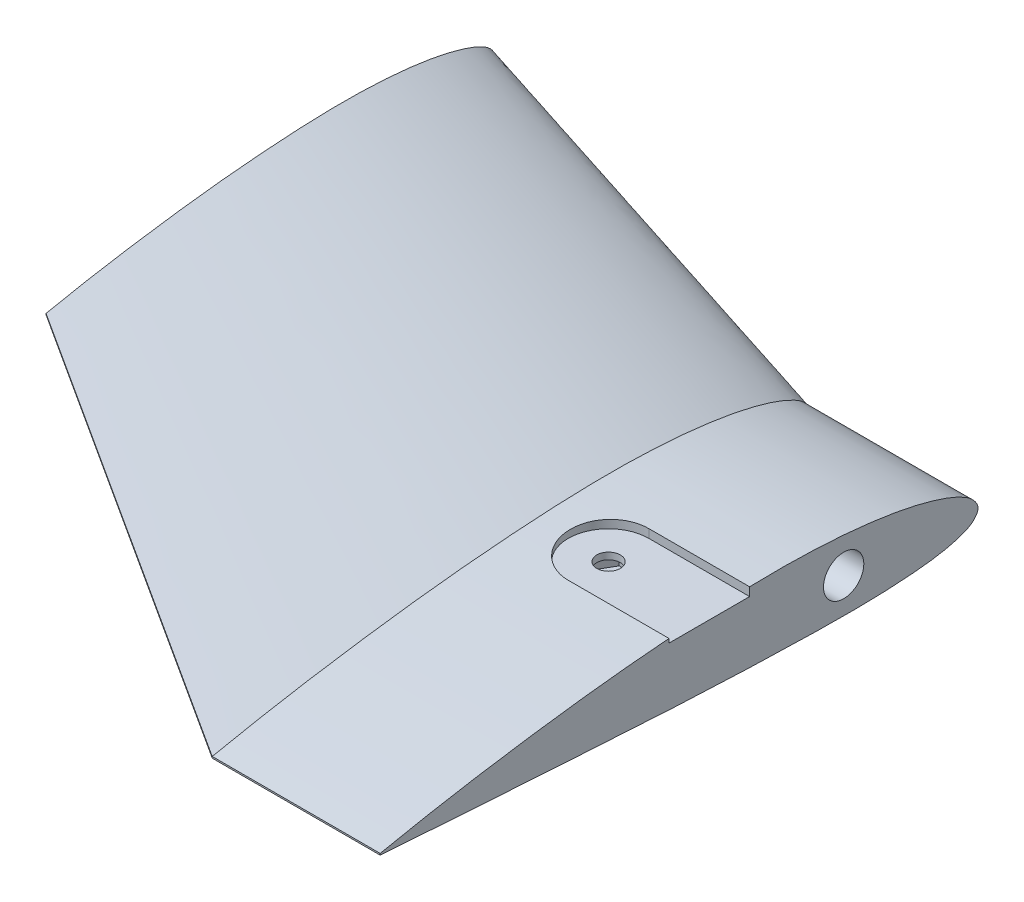
ISO-10303-21;
HEADER;
FILE_DESCRIPTION(('STEP AP214'),'2;1');
FILE_NAME('part.step','',(''),(''),'','','');
FILE_SCHEMA(('AUTOMOTIVE_DESIGN { 1 0 10303 214 1 1 1 1 }'));
ENDSEC;
DATA;
#1=APPLICATION_CONTEXT('core data for automotive mechanical design processes');
#2=APPLICATION_PROTOCOL_DEFINITION('international standard','automotive_design',2000,#1);
#3=PRODUCT_CONTEXT('',#1,'mechanical');
#4=PRODUCT('Part','Part','',(#3));
#5=PRODUCT_RELATED_PRODUCT_CATEGORY('part','',(#4));
#6=PRODUCT_DEFINITION_FORMATION('','',#4);
#7=PRODUCT_DEFINITION_CONTEXT('part definition',#1,'design');
#8=PRODUCT_DEFINITION('design','',#6,#7);
#9=PRODUCT_DEFINITION_SHAPE('','',#8);
#10=(LENGTH_UNIT() NAMED_UNIT(*) SI_UNIT(.MILLI.,.METRE.));
#11=(NAMED_UNIT(*) PLANE_ANGLE_UNIT() SI_UNIT($,.RADIAN.));
#12=(NAMED_UNIT(*) SI_UNIT($,.STERADIAN.) SOLID_ANGLE_UNIT());
#13=UNCERTAINTY_MEASURE_WITH_UNIT(LENGTH_MEASURE(1.E-05),#10,'distance_accuracy_value','');
#14=(GEOMETRIC_REPRESENTATION_CONTEXT(3) GLOBAL_UNCERTAINTY_ASSIGNED_CONTEXT((#13)) GLOBAL_UNIT_ASSIGNED_CONTEXT((#10,
#11,#12)) REPRESENTATION_CONTEXT('',''));
#15=CARTESIAN_POINT('',(0.,0.,0.));
#16=DIRECTION('',(0.,0.,1.));
#17=DIRECTION('',(1.,0.,0.));
#18=AXIS2_PLACEMENT_3D('',#15,#16,#17);
#19=CARTESIAN_POINT('',(-270.,22.7191945863651,20.));
#20=DIRECTION('',(1.,0.,0.));
#21=DIRECTION('',(0.,0.,-1.));
#22=AXIS2_PLACEMENT_3D('',#19,#20,#21);
#23=CYLINDRICAL_SURFACE('',#22,2.99999999999999);
#24=CARTESIAN_POINT('',(-270.,22.7191945863651,20.));
#25=DIRECTION('',(1.,0.,0.));
#26=DIRECTION('',(0.,0.,-1.));
#27=AXIS2_PLACEMENT_3D('',#24,#25,#26);
#28=CIRCLE('',#27,2.99999999999999);
#29=CARTESIAN_POINT('',(-270.,22.7191945863651,17.));
#30=VERTEX_POINT('',#29);
#31=EDGE_CURVE('E188',#30,#30,#28,.T.);
#32=ORIENTED_EDGE('',*,*,#31,.F.);
#33=EDGE_LOOP('',(#32));
#34=FACE_BOUND('',#33,.T.);
#35=CARTESIAN_POINT('',(-250.,22.7191945863651,20.));
#36=DIRECTION('',(1.,0.,0.));
#37=DIRECTION('',(0.,0.,-1.));
#38=AXIS2_PLACEMENT_3D('',#35,#36,#37);
#39=CIRCLE('',#38,2.99999999999999);
#40=CARTESIAN_POINT('',(-250.,22.7191945863651,17.));
#41=VERTEX_POINT('',#40);
#42=EDGE_CURVE('E197',#41,#41,#39,.T.);
#43=ORIENTED_EDGE('',*,*,#42,.T.);
#44=EDGE_LOOP('',(#43));
#45=FACE_BOUND('',#44,.T.);
#46=ADVANCED_FACE('F68',(#34,#45),#23,.F.);
#47=CARTESIAN_POINT('',(-270.,22.7191945863651,20.));
#48=DIRECTION('',(1.,0.,0.));
#49=DIRECTION('',(0.,0.,-1.));
#50=AXIS2_PLACEMENT_3D('',#47,#48,#49);
#51=PLANE('',#50);
#52=ORIENTED_EDGE('',*,*,#31,.T.);
#53=EDGE_LOOP('',(#52));
#54=FACE_BOUND('',#53,.T.);
#55=ADVANCED_FACE('F240',(#54),#51,.T.);
#56=CARTESIAN_POINT('',(-250.,0.,0.));
#57=DIRECTION('',(1.,0.,0.));
#58=DIRECTION('',(0.,0.,-1.));
#59=AXIS2_PLACEMENT_3D('',#56,#57,#58);
#60=PLANE('',#59);
#61=ORIENTED_EDGE('',*,*,#42,.F.);
#62=EDGE_LOOP('',(#61));
#63=FACE_BOUND('',#62,.T.);
#64=CARTESIAN_POINT('',(-250.,21.3886732850242,89.));
#65=CARTESIAN_POINT('',(-250.,21.6924393138106,87.5175902156763));
#66=CARTESIAN_POINT('',(-250.,22.2991735538198,84.5566640796384));
#67=CARTESIAN_POINT('',(-250.,23.4104909631112,78.6297269469736));
#68=CARTESIAN_POINT('',(-250.,24.641831569462,71.2170631809324));
#69=CARTESIAN_POINT('',(-250.,25.9162390672229,62.3159799477099));
#70=CARTESIAN_POINT('',(-250.,26.9790478293723,53.4163650243348));
#71=CARTESIAN_POINT('',(-250.,27.757252312656,44.5128917718668));
#72=CARTESIAN_POINT('',(-250.,28.2842497525229,35.6114461447732));
#73=CARTESIAN_POINT('',(-250.,28.3734546736372,28.1847004811248));
#74=CARTESIAN_POINT('',(-250.,28.1277297242642,22.2491575224991));
#75=CARTESIAN_POINT('',(-250.,27.7676716658709,17.7938603249267));
#76=CARTESIAN_POINT('',(-250.,27.1974963055456,13.3329383648118));
#77=CARTESIAN_POINT('',(-250.,26.4953694537602,9.62034210956704));
#78=CARTESIAN_POINT('',(-250.,25.701015566182,6.66058751576171));
#79=CARTESIAN_POINT('',(-250.,24.9788303768218,4.4166755350325));
#80=CARTESIAN_POINT('',(-250.,24.1373761617376,2.51552543990555));
#81=CARTESIAN_POINT('',(-250.,23.1172060054036,0.875610555548998));
#82=CARTESIAN_POINT('',(-250.,21.3529663487488,-0.554450875401541));
#83=CARTESIAN_POINT('',(-250.,19.8022315361252,0.931001928104729));
#84=CARTESIAN_POINT('',(-250.,19.0949550918379,2.54024256096899));
#85=CARTESIAN_POINT('',(-250.,18.5577036137218,4.43302859202716));
#86=CARTESIAN_POINT('',(-250.,18.1724928525861,6.66955299200507));
#87=CARTESIAN_POINT('',(-250.,17.8437583770492,9.64115310370391));
#88=CARTESIAN_POINT('',(-250.,17.590735707999,13.3504314681179));
#89=CARTESIAN_POINT('',(-250.,17.4892914666729,17.8043187113869));
#90=CARTESIAN_POINT('',(-250.,17.5034280625483,22.2550272141336));
#91=CARTESIAN_POINT('',(-250.,17.6344002740936,28.1885067397123));
#92=CARTESIAN_POINT('',(-250.,17.8700772068071,35.6060485187279));
#93=CARTESIAN_POINT('',(-250.,18.280226492312,44.5059981210921));
#94=CARTESIAN_POINT('',(-250.,18.8133186654621,53.4033670106579));
#95=CARTESIAN_POINT('',(-250.,19.3674253006102,62.3022449763705));
#96=CARTESIAN_POINT('',(-250.,19.9283008784247,71.2026444966919));
#97=CARTESIAN_POINT('',(-250.,20.4448648269986,78.6172037371231));
#98=CARTESIAN_POINT('',(-250.,20.8433000555565,84.5506800402072));
#99=CARTESIAN_POINT('',(-250.,21.052621242818,87.5168254487195));
#100=CARTESIAN_POINT('',(-250.,21.1572890238036,89.));
#101=B_SPLINE_CURVE_WITH_KNOTS('',3,(#64,#65,#66,#67,#68,#69,#70,#71,#72,#73,#74,#75,#76,#77,
#78,#79,#80,#81,#82,#83,#84,#85,#86,#87,#88,#89,#90,#91,#92,#93,#94,#95,#96,#97,#98,#99,#100),
.UNSPECIFIED.,.F.,.F.,(4,1,1,1,1,1,1,1,1,1,1,1,1,1,1,1,1,1,1,1,1,1,1,1,1,1,1,1,1,1,1,1,1,1,4),
(0.,0.0250124897498648,0.0499592861642578,0.0996729249269686,0.149206319909966,
0.198581096615965,0.247805170456833,0.296916574601493,0.345952721793533,0.370491625569911,
0.395091203654929,0.41981479582396,0.444798575016595,0.457489818915221,0.47040640543549,
0.483879408669829,0.491264120322896,0.503458853294665,0.513609129403887,0.520450990700287,
0.533235387615153,0.545691039147803,0.558031884237173,0.582609167247894,0.607134741746914,
0.631652079836766,0.656174271859652,0.705233949250519,0.754320378530032,0.803437363555032,
0.852566095729537,0.901700994033255,0.950848809337271,0.975422716989279,1.),.UNSPECIFIED.);
#102=CARTESIAN_POINT('',(-250.,21.1572890238036,89.));
#103=VERTEX_POINT('',#102);
#104=CARTESIAN_POINT('',(-250.,28.2645174071928,33.9999990139523));
#105=VERTEX_POINT('',#104);
#106=EDGE_CURVE('E262',#103,#105,#101,.F.);
#107=ORIENTED_EDGE('',*,*,#106,.T.);
#108=DIRECTION('',(0.,-1.,0.));
#109=VECTOR('',#108,1.);
#110=CARTESIAN_POINT('',(-250.,27.,33.9999990139523));
#111=LINE('',#110,#109);
#112=CARTESIAN_POINT('',(-250.,27.,33.9999990139523));
#113=VERTEX_POINT('',#112);
#114=EDGE_CURVE('E83',#105,#113,#111,.T.);
#115=ORIENTED_EDGE('',*,*,#114,.T.);
#116=DIRECTION('',(0.,0.,-1.));
#117=VECTOR('',#116,1.);
#118=CARTESIAN_POINT('',(-250.,27.,0.));
#119=LINE('',#118,#117);
#120=CARTESIAN_POINT('',(-250.,27.,45.9999990139523));
#121=VERTEX_POINT('',#120);
#122=EDGE_CURVE('E12',#121,#113,#119,.T.);
#123=ORIENTED_EDGE('',*,*,#122,.F.);
#124=DIRECTION('',(0.,-1.,0.));
#125=VECTOR('',#124,1.);
#126=CARTESIAN_POINT('',(-250.,27.,45.9999990139523));
#127=LINE('',#126,#125);
#128=CARTESIAN_POINT('',(-250.,27.6028781432274,45.9999990139523));
#129=VERTEX_POINT('',#128);
#130=EDGE_CURVE('E260',#129,#121,#127,.T.);
#131=ORIENTED_EDGE('',*,*,#130,.F.);
#132=CARTESIAN_POINT('',(-250.,21.3886732850242,89.));
#133=VERTEX_POINT('',#132);
#134=EDGE_CURVE('E169',#129,#133,#101,.F.);
#135=ORIENTED_EDGE('',*,*,#134,.T.);
#136=DIRECTION('',(0.,1.,0.));
#137=VECTOR('',#136,1.);
#138=CARTESIAN_POINT('',(-250.,0.,89.));
#139=LINE('',#138,#137);
#140=EDGE_CURVE('E112',#103,#133,#139,.T.);
#141=ORIENTED_EDGE('',*,*,#140,.F.);
#142=EDGE_LOOP('',(#107,#115,#123,#131,#135,#141));
#143=FACE_BOUND('',#142,.T.);
#144=ADVANCED_FACE('F218',(#63,#143),#60,.T.);
#145=CARTESIAN_POINT('',(-250.,21.3886732850242,89.));
#146=CARTESIAN_POINT('',(-250.,21.6924393138106,87.5175902156763));
#147=CARTESIAN_POINT('',(-250.,22.2991735538198,84.5566640796384));
#148=CARTESIAN_POINT('',(-250.,23.4104909631112,78.6297269469736));
#149=CARTESIAN_POINT('',(-250.,24.641831569462,71.2170631809324));
#150=CARTESIAN_POINT('',(-250.,25.9162390672229,62.3159799477099));
#151=CARTESIAN_POINT('',(-250.,26.9790478293723,53.4163650243348));
#152=CARTESIAN_POINT('',(-250.,27.757252312656,44.5128917718668));
#153=CARTESIAN_POINT('',(-250.,28.2842497525229,35.6114461447732));
#154=CARTESIAN_POINT('',(-250.,28.3734546736372,28.1847004811248));
#155=CARTESIAN_POINT('',(-250.,28.1277297242642,22.2491575224991));
#156=CARTESIAN_POINT('',(-250.,27.7676716658709,17.7938603249267));
#157=CARTESIAN_POINT('',(-250.,27.1974963055456,13.3329383648118));
#158=CARTESIAN_POINT('',(-250.,26.4953694537602,9.62034210956704));
#159=CARTESIAN_POINT('',(-250.,25.701015566182,6.66058751576171));
#160=CARTESIAN_POINT('',(-250.,24.9788303768218,4.4166755350325));
#161=CARTESIAN_POINT('',(-250.,24.1373761617376,2.51552543990555));
#162=CARTESIAN_POINT('',(-250.,23.1172060054036,0.875610555548998));
#163=CARTESIAN_POINT('',(-250.,21.3529663487488,-0.554450875401541));
#164=CARTESIAN_POINT('',(-250.,19.8022315361252,0.931001928104729));
#165=CARTESIAN_POINT('',(-250.,19.0949550918379,2.54024256096899));
#166=CARTESIAN_POINT('',(-250.,18.5577036137218,4.43302859202716));
#167=CARTESIAN_POINT('',(-250.,18.1724928525861,6.66955299200507));
#168=CARTESIAN_POINT('',(-250.,17.8437583770492,9.64115310370391));
#169=CARTESIAN_POINT('',(-250.,17.590735707999,13.3504314681179));
#170=CARTESIAN_POINT('',(-250.,17.4892914666729,17.8043187113869));
#171=CARTESIAN_POINT('',(-250.,17.5034280625483,22.2550272141336));
#172=CARTESIAN_POINT('',(-250.,17.6344002740936,28.1885067397123));
#173=CARTESIAN_POINT('',(-250.,17.8700772068071,35.6060485187279));
#174=CARTESIAN_POINT('',(-250.,18.280226492312,44.5059981210921));
#175=CARTESIAN_POINT('',(-250.,18.8133186654621,53.4033670106579));
#176=CARTESIAN_POINT('',(-250.,19.3674253006102,62.3022449763705));
#177=CARTESIAN_POINT('',(-250.,19.9283008784247,71.2026444966919));
#178=CARTESIAN_POINT('',(-250.,20.4448648269986,78.6172037371231));
#179=CARTESIAN_POINT('',(-250.,20.8433000555565,84.5506800402072));
#180=CARTESIAN_POINT('',(-250.,21.052621242818,87.5168254487195));
#181=CARTESIAN_POINT('',(-250.,21.1572890238036,89.));
#182=B_SPLINE_CURVE_WITH_KNOTS('',3,(#145,#146,#147,#148,#149,#150,#151,#152,#153,#154,#155,
#156,#157,#158,#159,#160,#161,#162,#163,#164,#165,#166,#167,#168,#169,#170,#171,#172,#173,#174,
#175,#176,#177,#178,#179,#180,#181),.UNSPECIFIED.,.F.,.F.,(4,1,1,1,1,1,1,1,1,1,1,1,1,1,1,1,1,1,
1,1,1,1,1,1,1,1,1,1,1,1,1,1,1,1,4),(0.,0.0250124897498648,0.0499592861642578,0.0996729249269686,
0.149206319909966,0.198581096615965,0.247805170456833,0.296916574601493,0.345952721793533,
0.370491625569911,0.395091203654929,0.41981479582396,0.444798575016595,0.457489818915221,
0.47040640543549,0.483879408669829,0.491264120322896,0.503458853294665,0.513609129403887,
0.520450990700287,0.533235387615153,0.545691039147803,0.558031884237173,0.582609167247894,
0.607134741746914,0.631652079836766,0.656174271859652,0.705233949250519,0.754320378530032,
0.803437363555032,0.852566095729537,0.901700994033255,0.950848809337271,0.975422716989279,1.),.UNSPECIFIED.);
#183=DIRECTION('',(1.,0.,0.));
#184=VECTOR('',#183,1.);
#185=SURFACE_OF_LINEAR_EXTRUSION('',#182,#184);
#186=ORIENTED_EDGE('',*,*,#106,.F.);
#187=DIRECTION('',(1.,0.,0.));
#188=VECTOR('',#187,1.);
#189=CARTESIAN_POINT('',(-250.,21.1572890238036,89.));
#190=LINE('',#189,#188);
#191=CARTESIAN_POINT('',(-275.,21.1572890238036,89.));
#192=VERTEX_POINT('',#191);
#193=EDGE_CURVE('E91',#192,#103,#190,.T.);
#194=ORIENTED_EDGE('',*,*,#193,.F.);
#195=CARTESIAN_POINT('',(-275.,21.3886732850242,89.));
#196=CARTESIAN_POINT('',(-275.,21.6924393138106,87.5175902156763));
#197=CARTESIAN_POINT('',(-275.,22.2991735538198,84.5566640796384));
#198=CARTESIAN_POINT('',(-275.,23.4104909631112,78.6297269469736));
#199=CARTESIAN_POINT('',(-275.,24.641831569462,71.2170631809324));
#200=CARTESIAN_POINT('',(-275.,25.9162390672229,62.3159799477099));
#201=CARTESIAN_POINT('',(-275.,26.9790478293723,53.4163650243348));
#202=CARTESIAN_POINT('',(-275.,27.757252312656,44.5128917718668));
#203=CARTESIAN_POINT('',(-275.,28.2842497525229,35.6114461447732));
#204=CARTESIAN_POINT('',(-275.,28.3734546736372,28.1847004811248));
#205=CARTESIAN_POINT('',(-275.,28.1277297242642,22.2491575224991));
#206=CARTESIAN_POINT('',(-275.,27.7676716658709,17.7938603249267));
#207=CARTESIAN_POINT('',(-275.,27.1974963055456,13.3329383648118));
#208=CARTESIAN_POINT('',(-275.,26.4953694537602,9.62034210956704));
#209=CARTESIAN_POINT('',(-275.,25.701015566182,6.66058751576171));
#210=CARTESIAN_POINT('',(-275.,24.9788303768218,4.4166755350325));
#211=CARTESIAN_POINT('',(-275.,24.1373761617376,2.51552543990555));
#212=CARTESIAN_POINT('',(-275.,23.1172060054036,0.875610555548998));
#213=CARTESIAN_POINT('',(-275.,21.3529663487488,-0.554450875401541));
#214=CARTESIAN_POINT('',(-275.,19.8022315361252,0.931001928104729));
#215=CARTESIAN_POINT('',(-275.,19.0949550918379,2.54024256096899));
#216=CARTESIAN_POINT('',(-275.,18.5577036137218,4.43302859202716));
#217=CARTESIAN_POINT('',(-275.,18.1724928525861,6.66955299200507));
#218=CARTESIAN_POINT('',(-275.,17.8437583770492,9.64115310370391));
#219=CARTESIAN_POINT('',(-275.,17.590735707999,13.3504314681179));
#220=CARTESIAN_POINT('',(-275.,17.4892914666729,17.8043187113869));
#221=CARTESIAN_POINT('',(-275.,17.5034280625483,22.2550272141336));
#222=CARTESIAN_POINT('',(-275.,17.6344002740936,28.1885067397123));
#223=CARTESIAN_POINT('',(-275.,17.8700772068071,35.6060485187279));
#224=CARTESIAN_POINT('',(-275.,18.280226492312,44.5059981210921));
#225=CARTESIAN_POINT('',(-275.,18.8133186654621,53.4033670106579));
#226=CARTESIAN_POINT('',(-275.,19.3674253006102,62.3022449763705));
#227=CARTESIAN_POINT('',(-275.,19.9283008784247,71.2026444966919));
#228=CARTESIAN_POINT('',(-275.,20.4448648269986,78.6172037371231));
#229=CARTESIAN_POINT('',(-275.,20.8433000555565,84.5506800402072));
#230=CARTESIAN_POINT('',(-275.,21.052621242818,87.5168254487195));
#231=CARTESIAN_POINT('',(-275.,21.1572890238036,89.));
#232=B_SPLINE_CURVE_WITH_KNOTS('',3,(#195,#196,#197,#198,#199,#200,#201,#202,#203,#204,#205,
#206,#207,#208,#209,#210,#211,#212,#213,#214,#215,#216,#217,#218,#219,#220,#221,#222,#223,#224,
#225,#226,#227,#228,#229,#230,#231),.UNSPECIFIED.,.F.,.F.,(4,1,1,1,1,1,1,1,1,1,1,1,1,1,1,1,1,1,
1,1,1,1,1,1,1,1,1,1,1,1,1,1,1,1,4),(0.,0.0250124897498648,0.0499592861642578,0.0996729249269686,
0.149206319909966,0.198581096615965,0.247805170456833,0.296916574601493,0.345952721793533,
0.370491625569911,0.395091203654929,0.41981479582396,0.444798575016595,0.457489818915221,
0.47040640543549,0.483879408669829,0.491264120322896,0.503458853294665,0.513609129403887,
0.520450990700287,0.533235387615153,0.545691039147803,0.558031884237173,0.582609167247894,
0.607134741746914,0.631652079836766,0.656174271859652,0.705233949250519,0.754320378530032,
0.803437363555032,0.852566095729537,0.901700994033255,0.950848809337271,0.975422716989279,1.),.UNSPECIFIED.);
#233=CARTESIAN_POINT('',(-275.,21.3886732850242,89.));
#234=VERTEX_POINT('',#233);
#235=EDGE_CURVE('E102',#234,#192,#232,.T.);
#236=ORIENTED_EDGE('',*,*,#235,.F.);
#237=DIRECTION('',(1.,0.,0.));
#238=VECTOR('',#237,1.);
#239=CARTESIAN_POINT('',(-250.,21.3886732850242,89.));
#240=LINE('',#239,#238);
#241=EDGE_CURVE('E206',#234,#133,#240,.T.);
#242=ORIENTED_EDGE('',*,*,#241,.T.);
#243=ORIENTED_EDGE('',*,*,#134,.F.);
#244=DIRECTION('',(1.,0.,0.));
#245=VECTOR('',#244,1.);
#246=CARTESIAN_POINT('',(-250.,27.6028781432274,45.9999990139523));
#247=LINE('',#246,#245);
#248=CARTESIAN_POINT('',(-265.,27.6028781432274,45.9999990139523));
#249=VERTEX_POINT('',#248);
#250=EDGE_CURVE('E164',#249,#129,#247,.T.);
#251=ORIENTED_EDGE('',*,*,#250,.F.);
#252=CARTESIAN_POINT('',(-265.,27.6028781432274,45.9999990139523));
#253=CARTESIAN_POINT('',(-265.168406551892,27.6028756738194,46.0000174283823));
#254=CARTESIAN_POINT('',(-265.336810259643,27.6034315773635,45.9929095990154));
#255=CARTESIAN_POINT('',(-265.672409436757,27.6056422724076,45.9645746032928));
#256=CARTESIAN_POINT('',(-265.839604972365,27.6072970031885,45.943348217102));
#257=CARTESIAN_POINT('',(-266.171471284373,27.6116857416299,45.8869318142982));
#258=CARTESIAN_POINT('',(-266.336143974186,27.6144188845175,45.8517529859586));
#259=CARTESIAN_POINT('',(-266.661930509344,27.620929760558,45.7676920766072));
#260=CARTESIAN_POINT('',(-266.823044392723,27.624707482541,45.7188101421267));
#261=CARTESIAN_POINT('',(-267.140611954951,27.633262386348,45.6076802095232));
#262=CARTESIAN_POINT('',(-267.29706446872,27.638039815688,45.5454289011966));
#263=CARTESIAN_POINT('',(-267.604216969098,27.6485374674803,45.4079905223707));
#264=CARTESIAN_POINT('',(-267.754914809119,27.6542580375894,45.3327986813323));
#265=CARTESIAN_POINT('',(-268.049352479391,27.6665690545499,45.1700790112916));
#266=CARTESIAN_POINT('',(-268.193096016986,27.6731590307783,45.0825578546146));
#267=CARTESIAN_POINT('',(-268.472751686933,27.6871365287768,44.8957403487733));
#268=CARTESIAN_POINT('',(-268.608660903716,27.694524344564,44.7964396573201));
#269=CARTESIAN_POINT('',(-268.871789471173,27.7100202229241,44.5866741765286));
#270=CARTESIAN_POINT('',(-268.998998445499,27.7181291198796,44.4761964330272));
#271=CARTESIAN_POINT('',(-269.243702661083,27.7349705161589,44.2449184081904));
#272=CARTESIAN_POINT('',(-269.361194299962,27.7437032445312,44.1241143321613));
#273=CARTESIAN_POINT('',(-269.585563609,27.761686786127,43.8731033950914));
#274=CARTESIAN_POINT('',(-269.692443484708,27.7709374910665,43.7428984976755));
#275=CARTESIAN_POINT('',(-269.894905958753,27.7898568961494,43.4739361400531));
#276=CARTESIAN_POINT('',(-269.990484363032,27.7995257496641,43.3351755336461));
#277=CARTESIAN_POINT('',(-270.169832795285,27.8191921028246,43.0498013813754));
#278=CARTESIAN_POINT('',(-270.253575444911,27.829190300554,42.9031706766799));
#279=CARTESIAN_POINT('',(-270.408432886123,27.8493875448074,42.6033306294298));
#280=CARTESIAN_POINT('',(-270.479542999208,27.8595866641965,42.4501188755414));
#281=CARTESIAN_POINT('',(-270.60856888684,27.8800677384596,42.1383184085328));
#282=CARTESIAN_POINT('',(-270.666490221077,27.8903496565305,41.9797319935945));
#283=CARTESIAN_POINT('',(-270.768786745529,27.9108968844158,41.6581831170473));
#284=CARTESIAN_POINT('',(-270.813156940432,27.9211621867215,41.4952190657502));
#285=CARTESIAN_POINT('',(-270.88805154045,27.9415812213932,41.1659291132508));
#286=CARTESIAN_POINT('',(-270.918559496103,27.9517348073298,40.9995994613829));
#287=CARTESIAN_POINT('',(-270.965441351842,27.971824104632,40.6648876321152));
#288=CARTESIAN_POINT('',(-270.981810326534,27.9817597388991,40.4965047601625));
#289=CARTESIAN_POINT('',(-271.000274470165,28.0013183844602,40.1589655595871));
#290=CARTESIAN_POINT('',(-271.002371787906,28.0109414426,39.9898093512395));
#291=CARTESIAN_POINT('',(-270.992278295377,28.0297963248266,39.651901948485));
#292=CARTESIAN_POINT('',(-270.980087504328,28.0390281494399,39.4831507535335));
#293=CARTESIAN_POINT('',(-270.941504413677,28.0570284528131,39.1473049628488));
#294=CARTESIAN_POINT('',(-270.915116281239,28.0657970667045,38.9802098956628));
#295=CARTESIAN_POINT('',(-270.848334591664,28.0828131108789,38.6488761633339));
#296=CARTESIAN_POINT('',(-270.807945933981,28.0910607222936,38.4846365200286));
#297=CARTESIAN_POINT('',(-270.713426270581,28.1069954385908,38.1600697877123));
#298=CARTESIAN_POINT('',(-270.659290464254,28.1146823464618,37.9997440869625));
#299=CARTESIAN_POINT('',(-270.537686397763,28.1294567558033,37.6842709526279));
#300=CARTESIAN_POINT('',(-270.470223084752,28.1365444783008,37.5291216224849));
#301=CARTESIAN_POINT('',(-270.322516194777,28.1500949894031,37.2252326045975));
#302=CARTESIAN_POINT('',(-270.242288027328,28.1565585165973,37.0764854598692));
#303=CARTESIAN_POINT('',(-270.069592894895,28.1688591976209,36.7863216919216));
#304=CARTESIAN_POINT('',(-269.977130485994,28.1746965831698,36.6449023669421));
#305=CARTESIAN_POINT('',(-269.780567889284,28.185751510772,36.370303436427));
#306=CARTESIAN_POINT('',(-269.676464034207,28.1909688564278,36.2371264480183));
#307=CARTESIAN_POINT('',(-269.45742260586,28.2007912352736,35.9800626492795));
#308=CARTESIAN_POINT('',(-269.342489062254,28.2053964946918,35.8561724139722));
#309=CARTESIAN_POINT('',(-269.102703562333,28.2140117352323,35.6186439990215));
#310=CARTESIAN_POINT('',(-268.977862517945,28.2180223576819,35.5049948268733));
#311=CARTESIAN_POINT('',(-268.719088388689,28.2254777284225,35.2886495936159));
#312=CARTESIAN_POINT('',(-268.585158687845,28.2289226857142,35.1859494920069));
#313=CARTESIAN_POINT('',(-268.309023219798,28.2352795054698,34.9921212383865));
#314=CARTESIAN_POINT('',(-268.166811857194,28.2381910018689,34.9010010456318));
#315=CARTESIAN_POINT('',(-267.875262610826,28.2435082066694,34.7310976710892));
#316=CARTESIAN_POINT('',(-267.725927379476,28.2459141015442,34.6523099436469));
#317=CARTESIAN_POINT('',(-267.421073502335,28.2502537027645,34.5075597672504));
#318=CARTESIAN_POINT('',(-267.265552001808,28.2521871881005,34.4416033241394));
#319=CARTESIAN_POINT('',(-266.949557032559,28.255609176302,34.3230551079489));
#320=CARTESIAN_POINT('',(-266.789085449824,28.2570978463877,34.2704583136718));
#321=CARTESIAN_POINT('',(-266.464460238465,28.2596551946064,34.1790228218515));
#322=CARTESIAN_POINT('',(-266.30031083192,28.2607243306214,34.1401691296011));
#323=CARTESIAN_POINT('',(-265.969387100899,28.2624645003873,34.0764307760397));
#324=CARTESIAN_POINT('',(-265.802614101033,28.2631357288073,34.0515392842934));
#325=CARTESIAN_POINT('',(-265.529568010576,28.2639167929611,34.0224718249607));
#326=CARTESIAN_POINT('',(-265.423730125954,28.2641424414296,34.0140391629008));
#327=CARTESIAN_POINT('',(-265.211931807482,28.2644425105844,34.002806778438));
#328=CARTESIAN_POINT('',(-265.105971868385,28.2645171815837,33.999997732446));
#329=CARTESIAN_POINT('',(-265.,28.2645174071928,33.9999990139523));
#330=B_SPLINE_CURVE_WITH_KNOTS('',3,(#252,#253,#254,#255,#256,#257,#258,#259,#260,#261,#262,
#263,#264,#265,#266,#267,#268,#269,#270,#271,#272,#273,#274,#275,#276,#277,#278,#279,#280,#281,
#282,#283,#284,#285,#286,#287,#288,#289,#290,#291,#292,#293,#294,#295,#296,#297,#298,#299,#300,
#301,#302,#303,#304,#305,#306,#307,#308,#309,#310,#311,#312,#313,#314,#315,#316,#317,#318,#319,
#320,#321,#322,#323,#324,#325,#326,#327,#328,#329),.UNSPECIFIED.,.F.,.F.,(4,2,2,2,2,2,2,2,2,2,2,
2,2,2,2,2,2,2,2,2,2,2,2,2,2,2,2,2,2,2,2,2,2,2,2,2,2,2,4),(0.,0.505064750494344,1.01010159437677,
1.51473427224653,2.01936155414031,2.52411392407998,3.02905277159208,3.5337194008195,
4.03857264677817,4.54401786885107,5.04964963574829,5.55517609114854,6.06088956606916,
6.56775434920811,7.07480646171277,7.58164443058503,8.08866900858083,8.59629368007032,
9.10409511430924,9.6118200900694,10.1195443827946,10.6271197309731,11.1345176332682,
11.642092967058,12.1494802423609,12.6562595918172,13.1628507429185,13.6696019314528,
14.176165299901,14.6821782925075,15.1880039016836,15.6941753225807,16.2001597308948,
16.7063804047161,17.2124105340162,17.7178868327149,18.2231156316656,18.5414985659796,
18.8593532035252),.UNSPECIFIED.);
#331=CARTESIAN_POINT('',(-265.,28.2645174071928,33.9999990139523));
#332=VERTEX_POINT('',#331);
#333=EDGE_CURVE('E76',#249,#332,#330,.T.);
#334=ORIENTED_EDGE('',*,*,#333,.T.);
#335=DIRECTION('',(1.,0.,0.));
#336=VECTOR('',#335,1.);
#337=CARTESIAN_POINT('',(-250.,28.2645174071928,33.9999990139523));
#338=LINE('',#337,#336);
#339=EDGE_CURVE('E173',#332,#105,#338,.T.);
#340=ORIENTED_EDGE('',*,*,#339,.T.);
#341=EDGE_LOOP('',(#186,#194,#236,#242,#243,#251,#334,#340));
#342=FACE_BOUND('',#341,.T.);
#343=ADVANCED_FACE('F166',(#342),#185,.F.);
#344=CARTESIAN_POINT('',(0.,0.,89.));
#345=DIRECTION('',(0.,0.,1.));
#346=DIRECTION('',(1.,0.,0.));
#347=AXIS2_PLACEMENT_3D('',#344,#345,#346);
#348=PLANE('',#347);
#349=ORIENTED_EDGE('',*,*,#193,.T.);
#350=ORIENTED_EDGE('',*,*,#140,.T.);
#351=ORIENTED_EDGE('',*,*,#241,.F.);
#352=DIRECTION('',(0.,1.,0.));
#353=VECTOR('',#352,1.);
#354=CARTESIAN_POINT('',(-275.,0.,89.));
#355=LINE('',#354,#353);
#356=EDGE_CURVE('E203',#192,#234,#355,.T.);
#357=ORIENTED_EDGE('',*,*,#356,.F.);
#358=EDGE_LOOP('',(#349,#350,#351,#357));
#359=FACE_BOUND('',#358,.T.);
#360=ADVANCED_FACE('F70',(#359),#348,.T.);
#361=CARTESIAN_POINT('',(-330.,27.,33.9999990139523));
#362=DIRECTION('',(0.,0.,-1.));
#363=DIRECTION('',(-1.,0.,0.));
#364=AXIS2_PLACEMENT_3D('',#361,#362,#363);
#365=PLANE('',#364);
#366=ORIENTED_EDGE('',*,*,#114,.F.);
#367=ORIENTED_EDGE('',*,*,#339,.F.);
#368=DIRECTION('',(0.,1.,0.));
#369=VECTOR('',#368,1.);
#370=CARTESIAN_POINT('',(-265.,27.,33.9999990139523));
#371=LINE('',#370,#369);
#372=CARTESIAN_POINT('',(-265.,27.,33.9999990139523));
#373=VERTEX_POINT('',#372);
#374=EDGE_CURVE('E184',#373,#332,#371,.T.);
#375=ORIENTED_EDGE('',*,*,#374,.F.);
#376=DIRECTION('',(-1.,0.,0.));
#377=VECTOR('',#376,1.);
#378=CARTESIAN_POINT('',(-330.,27.,33.9999990139523));
#379=LINE('',#378,#377);
#380=EDGE_CURVE('E201',#113,#373,#379,.T.);
#381=ORIENTED_EDGE('',*,*,#380,.F.);
#382=EDGE_LOOP('',(#366,#367,#375,#381));
#383=FACE_BOUND('',#382,.T.);
#384=ADVANCED_FACE('F219',(#383),#365,.F.);
#385=CARTESIAN_POINT('',(-330.,27.,45.9999990139523));
#386=DIRECTION('',(0.,0.,-1.));
#387=DIRECTION('',(-1.,0.,0.));
#388=AXIS2_PLACEMENT_3D('',#385,#386,#387);
#389=PLANE('',#388);
#390=ORIENTED_EDGE('',*,*,#250,.T.);
#391=ORIENTED_EDGE('',*,*,#130,.T.);
#392=DIRECTION('',(-1.,0.,0.));
#393=VECTOR('',#392,1.);
#394=CARTESIAN_POINT('',(-330.,27.,45.9999990139523));
#395=LINE('',#394,#393);
#396=CARTESIAN_POINT('',(-265.,27.,45.9999990139523));
#397=VERTEX_POINT('',#396);
#398=EDGE_CURVE('E174',#121,#397,#395,.T.);
#399=ORIENTED_EDGE('',*,*,#398,.T.);
#400=DIRECTION('',(0.,1.,0.));
#401=VECTOR('',#400,1.);
#402=CARTESIAN_POINT('',(-265.,27.,45.9999990139523));
#403=LINE('',#402,#401);
#404=EDGE_CURVE('E181',#397,#249,#403,.T.);
#405=ORIENTED_EDGE('',*,*,#404,.T.);
#406=EDGE_LOOP('',(#390,#391,#399,#405));
#407=FACE_BOUND('',#406,.T.);
#408=ADVANCED_FACE('F186',(#407),#389,.T.);
#409=CARTESIAN_POINT('',(-330.,27.,0.));
#410=DIRECTION('',(0.,1.,0.));
#411=DIRECTION('',(0.,0.,1.));
#412=AXIS2_PLACEMENT_3D('',#409,#410,#411);
#413=PLANE('',#412);
#414=CARTESIAN_POINT('',(-265.,27.,39.9999990139523));
#415=DIRECTION('',(0.,1.,0.));
#416=DIRECTION('',(0.,0.,-1.));
#417=AXIS2_PLACEMENT_3D('',#414,#415,#416);
#418=CIRCLE('',#417,1.75);
#419=CARTESIAN_POINT('',(-265.,27.,38.2499990139523));
#420=VERTEX_POINT('',#419);
#421=EDGE_CURVE('E288',#420,#420,#418,.T.);
#422=ORIENTED_EDGE('',*,*,#421,.F.);
#423=EDGE_LOOP('',(#422));
#424=FACE_BOUND('',#423,.T.);
#425=ORIENTED_EDGE('',*,*,#398,.F.);
#426=ORIENTED_EDGE('',*,*,#122,.T.);
#427=ORIENTED_EDGE('',*,*,#380,.T.);
#428=CARTESIAN_POINT('',(-265.,27.,39.9999990139523));
#429=DIRECTION('',(0.,1.,0.));
#430=DIRECTION('',(0.,0.,1.));
#431=AXIS2_PLACEMENT_3D('',#428,#429,#430);
#432=CIRCLE('',#431,6.);
#433=EDGE_CURVE('E192',#373,#397,#432,.T.);
#434=ORIENTED_EDGE('',*,*,#433,.T.);
#435=EDGE_LOOP('',(#425,#426,#427,#434));
#436=FACE_BOUND('',#435,.T.);
#437=ADVANCED_FACE('F247',(#424,#436),#413,.T.);
#438=CARTESIAN_POINT('',(-265.,23.,39.9999990139523));
#439=DIRECTION('',(0.,1.,0.));
#440=DIRECTION('',(0.,0.,1.));
#441=AXIS2_PLACEMENT_3D('',#438,#439,#440);
#442=CYLINDRICAL_SURFACE('',#441,1.75);
#443=ORIENTED_EDGE('',*,*,#421,.T.);
#444=EDGE_LOOP('',(#443));
#445=FACE_BOUND('',#444,.T.);
#446=CARTESIAN_POINT('',(-265.,26.,39.9999990139523));
#447=DIRECTION('',(0.,-1.,0.));
#448=DIRECTION('',(0.,0.,-1.));
#449=AXIS2_PLACEMENT_3D('',#446,#447,#448);
#450=CIRCLE('',#449,1.75);
#451=CARTESIAN_POINT('',(-265.,26.,38.2499990139523));
#452=VERTEX_POINT('',#451);
#453=EDGE_CURVE('E283',#452,#452,#450,.F.);
#454=ORIENTED_EDGE('',*,*,#453,.F.);
#455=EDGE_LOOP('',(#454));
#456=FACE_BOUND('',#455,.T.);
#457=ADVANCED_FACE('F237',(#445,#456),#442,.F.);
#458=CARTESIAN_POINT('',(-265.,27.,39.9999990139523));
#459=DIRECTION('',(0.,1.,0.));
#460=DIRECTION('',(0.,0.,1.));
#461=AXIS2_PLACEMENT_3D('',#458,#459,#460);
#462=CYLINDRICAL_SURFACE('',#461,6.);
#463=ORIENTED_EDGE('',*,*,#404,.F.);
#464=ORIENTED_EDGE('',*,*,#433,.F.);
#465=ORIENTED_EDGE('',*,*,#374,.T.);
#466=ORIENTED_EDGE('',*,*,#333,.F.);
#467=EDGE_LOOP('',(#463,#464,#465,#466));
#468=FACE_BOUND('',#467,.T.);
#469=ADVANCED_FACE('F179',(#468),#462,.F.);
#470=CARTESIAN_POINT('',(-170.,26.,0.));
#471=DIRECTION('',(0.,-1.,0.));
#472=DIRECTION('',(0.,0.,-1.));
#473=AXIS2_PLACEMENT_3D('',#470,#471,#472);
#474=PLANE('',#473);
#475=DIRECTION('',(-0.499999999999998,0.,-0.86602540378444));
#476=VECTOR('',#475,1.);
#477=CARTESIAN_POINT('',(-262.834936490539,26.,36.2499990139523));
#478=LINE('',#477,#476);
#479=CARTESIAN_POINT('',(-260.669872981078,26.,39.9999990139523));
#480=VERTEX_POINT('',#479);
#481=CARTESIAN_POINT('',(-262.834936490539,26.,36.2499990139523));
#482=VERTEX_POINT('',#481);
#483=EDGE_CURVE('E373',#480,#482,#478,.T.);
#484=ORIENTED_EDGE('',*,*,#483,.F.);
#485=DIRECTION('',(0.5,0.,-0.866025403784438));
#486=VECTOR('',#485,1.);
#487=CARTESIAN_POINT('',(-260.669872981078,26.,39.9999990139523));
#488=LINE('',#487,#486);
#489=CARTESIAN_POINT('',(-262.834936490539,26.,43.7499990139523));
#490=VERTEX_POINT('',#489);
#491=EDGE_CURVE('E389',#490,#480,#488,.T.);
#492=ORIENTED_EDGE('',*,*,#491,.F.);
#493=DIRECTION('',(1.,0.,0.));
#494=VECTOR('',#493,1.);
#495=CARTESIAN_POINT('',(-262.834936490539,26.,43.7499990139523));
#496=LINE('',#495,#494);
#497=CARTESIAN_POINT('',(-267.165063509461,26.,43.7499990139523));
#498=VERTEX_POINT('',#497);
#499=EDGE_CURVE('E387',#498,#490,#496,.T.);
#500=ORIENTED_EDGE('',*,*,#499,.F.);
#501=DIRECTION('',(0.5,0.,0.866025403784439));
#502=VECTOR('',#501,1.);
#503=CARTESIAN_POINT('',(-267.165063509461,26.,43.7499990139523));
#504=LINE('',#503,#502);
#505=CARTESIAN_POINT('',(-269.330127018922,26.,39.9999990139523));
#506=VERTEX_POINT('',#505);
#507=EDGE_CURVE('E385',#506,#498,#504,.T.);
#508=ORIENTED_EDGE('',*,*,#507,.F.);
#509=DIRECTION('',(-0.500000000000003,0.,0.866025403784437));
#510=VECTOR('',#509,1.);
#511=CARTESIAN_POINT('',(-269.330127018922,26.,39.9999990139523));
#512=LINE('',#511,#510);
#513=CARTESIAN_POINT('',(-267.165063509461,26.,36.2499990139523));
#514=VERTEX_POINT('',#513);
#515=EDGE_CURVE('E383',#514,#506,#512,.T.);
#516=ORIENTED_EDGE('',*,*,#515,.F.);
#517=DIRECTION('',(-1.,0.,0.));
#518=VECTOR('',#517,1.);
#519=CARTESIAN_POINT('',(-267.165063509461,26.,36.2499990139523));
#520=LINE('',#519,#518);
#521=EDGE_CURVE('E380',#482,#514,#520,.T.);
#522=ORIENTED_EDGE('',*,*,#521,.F.);
#523=EDGE_LOOP('',(#484,#492,#500,#508,#516,#522));
#524=FACE_BOUND('',#523,.T.);
#525=ORIENTED_EDGE('',*,*,#453,.T.);
#526=EDGE_LOOP('',(#525));
#527=FACE_BOUND('',#526,.T.);
#528=ADVANCED_FACE('F236',(#524,#527),#474,.T.);
#529=CARTESIAN_POINT('',(-170.,23.5,0.));
#530=DIRECTION('',(0.,-1.,0.));
#531=DIRECTION('',(0.,0.,-1.));
#532=AXIS2_PLACEMENT_3D('',#529,#530,#531);
#533=PLANE('',#532);
#534=DIRECTION('',(-0.499999999999998,0.,-0.86602540378444));
#535=VECTOR('',#534,1.);
#536=CARTESIAN_POINT('',(-262.834936490539,23.5,36.2499990139523));
#537=LINE('',#536,#535);
#538=CARTESIAN_POINT('',(-260.669872981078,23.5,39.9999990139523));
#539=VERTEX_POINT('',#538);
#540=CARTESIAN_POINT('',(-262.834936490539,23.5,36.2499990139523));
#541=VERTEX_POINT('',#540);
#542=EDGE_CURVE('E392',#539,#541,#537,.T.);
#543=ORIENTED_EDGE('',*,*,#542,.T.);
#544=DIRECTION('',(-1.,0.,0.));
#545=VECTOR('',#544,1.);
#546=CARTESIAN_POINT('',(-267.165063509461,23.5,36.2499990139523));
#547=LINE('',#546,#545);
#548=CARTESIAN_POINT('',(-267.165063509461,23.5,36.2499990139523));
#549=VERTEX_POINT('',#548);
#550=EDGE_CURVE('E394',#541,#549,#547,.T.);
#551=ORIENTED_EDGE('',*,*,#550,.T.);
#552=DIRECTION('',(-0.500000000000003,0.,0.866025403784437));
#553=VECTOR('',#552,1.);
#554=CARTESIAN_POINT('',(-269.330127018922,23.5,39.9999990139523));
#555=LINE('',#554,#553);
#556=CARTESIAN_POINT('',(-269.330127018922,23.5,39.9999990139523));
#557=VERTEX_POINT('',#556);
#558=EDGE_CURVE('E396',#549,#557,#555,.T.);
#559=ORIENTED_EDGE('',*,*,#558,.T.);
#560=DIRECTION('',(0.5,0.,0.866025403784439));
#561=VECTOR('',#560,1.);
#562=CARTESIAN_POINT('',(-267.165063509461,23.5,43.7499990139523));
#563=LINE('',#562,#561);
#564=CARTESIAN_POINT('',(-267.165063509461,23.5,43.7499990139523));
#565=VERTEX_POINT('',#564);
#566=EDGE_CURVE('E398',#557,#565,#563,.T.);
#567=ORIENTED_EDGE('',*,*,#566,.T.);
#568=DIRECTION('',(1.,0.,0.));
#569=VECTOR('',#568,1.);
#570=CARTESIAN_POINT('',(-262.834936490539,23.5,43.7499990139523));
#571=LINE('',#570,#569);
#572=CARTESIAN_POINT('',(-262.834936490539,23.5,43.7499990139523));
#573=VERTEX_POINT('',#572);
#574=EDGE_CURVE('E400',#565,#573,#571,.T.);
#575=ORIENTED_EDGE('',*,*,#574,.T.);
#576=DIRECTION('',(0.5,0.,-0.866025403784438));
#577=VECTOR('',#576,1.);
#578=CARTESIAN_POINT('',(-260.669872981078,23.5,39.9999990139523));
#579=LINE('',#578,#577);
#580=EDGE_CURVE('E381',#573,#539,#579,.T.);
#581=ORIENTED_EDGE('',*,*,#580,.T.);
#582=EDGE_LOOP('',(#543,#551,#559,#567,#575,#581));
#583=FACE_BOUND('',#582,.T.);
#584=CARTESIAN_POINT('',(-265.,23.5,39.9999990139523));
#585=DIRECTION('',(0.,-1.,0.));
#586=DIRECTION('',(0.,0.,-1.));
#587=AXIS2_PLACEMENT_3D('',#584,#585,#586);
#588=CIRCLE('',#587,1.75);
#589=CARTESIAN_POINT('',(-265.,23.5,38.2499990139523));
#590=VERTEX_POINT('',#589);
#591=EDGE_CURVE('E230',#590,#590,#588,.F.);
#592=ORIENTED_EDGE('',*,*,#591,.F.);
#593=EDGE_LOOP('',(#592));
#594=FACE_BOUND('',#593,.T.);
#595=ADVANCED_FACE('F424',(#583,#594),#533,.F.);
#596=CARTESIAN_POINT('',(-262.834936490539,26.,36.2499990139523));
#597=DIRECTION('',(-0.86602540378444,0.,0.499999999999998));
#598=DIRECTION('',(0.499999999999998,0.,0.86602540378444));
#599=AXIS2_PLACEMENT_3D('',#596,#597,#598);
#600=PLANE('',#599);
#601=ORIENTED_EDGE('',*,*,#542,.F.);
#602=DIRECTION('',(0.,-1.,0.));
#603=VECTOR('',#602,1.);
#604=CARTESIAN_POINT('',(-260.669872981078,26.,39.9999990139523));
#605=LINE('',#604,#603);
#606=EDGE_CURVE('E391',#480,#539,#605,.T.);
#607=ORIENTED_EDGE('',*,*,#606,.F.);
#608=ORIENTED_EDGE('',*,*,#483,.T.);
#609=DIRECTION('',(0.,-1.,0.));
#610=VECTOR('',#609,1.);
#611=CARTESIAN_POINT('',(-262.834936490539,26.,36.2499990139523));
#612=LINE('',#611,#610);
#613=EDGE_CURVE('E294',#482,#541,#612,.T.);
#614=ORIENTED_EDGE('',*,*,#613,.T.);
#615=EDGE_LOOP('',(#601,#607,#608,#614));
#616=FACE_BOUND('',#615,.T.);
#617=ADVANCED_FACE('F439',(#616),#600,.T.);
#618=CARTESIAN_POINT('',(-267.165063509461,26.,36.2499990139523));
#619=DIRECTION('',(0.,0.,1.));
#620=DIRECTION('',(1.,0.,0.));
#621=AXIS2_PLACEMENT_3D('',#618,#619,#620);
#622=PLANE('',#621);
#623=ORIENTED_EDGE('',*,*,#550,.F.);
#624=ORIENTED_EDGE('',*,*,#613,.F.);
#625=ORIENTED_EDGE('',*,*,#521,.T.);
#626=DIRECTION('',(0.,-1.,0.));
#627=VECTOR('',#626,1.);
#628=CARTESIAN_POINT('',(-267.165063509461,26.,36.2499990139523));
#629=LINE('',#628,#627);
#630=EDGE_CURVE('E298',#514,#549,#629,.T.);
#631=ORIENTED_EDGE('',*,*,#630,.T.);
#632=EDGE_LOOP('',(#623,#624,#625,#631));
#633=FACE_BOUND('',#632,.T.);
#634=ADVANCED_FACE('F427',(#633),#622,.T.);
#635=CARTESIAN_POINT('',(-269.330127018922,26.,39.9999990139523));
#636=DIRECTION('',(0.866025403784437,0.,0.500000000000003));
#637=DIRECTION('',(0.500000000000003,0.,-0.866025403784437));
#638=AXIS2_PLACEMENT_3D('',#635,#636,#637);
#639=PLANE('',#638);
#640=ORIENTED_EDGE('',*,*,#558,.F.);
#641=ORIENTED_EDGE('',*,*,#630,.F.);
#642=ORIENTED_EDGE('',*,*,#515,.T.);
#643=DIRECTION('',(0.,-1.,0.));
#644=VECTOR('',#643,1.);
#645=CARTESIAN_POINT('',(-269.330127018922,26.,39.9999990139523));
#646=LINE('',#645,#644);
#647=EDGE_CURVE('E306',#506,#557,#646,.T.);
#648=ORIENTED_EDGE('',*,*,#647,.T.);
#649=EDGE_LOOP('',(#640,#641,#642,#648));
#650=FACE_BOUND('',#649,.T.);
#651=ADVANCED_FACE('F415',(#650),#639,.T.);
#652=CARTESIAN_POINT('',(-267.165063509461,26.,43.7499990139523));
#653=DIRECTION('',(0.866025403784439,0.,-0.5));
#654=DIRECTION('',(-0.5,0.,-0.866025403784439));
#655=AXIS2_PLACEMENT_3D('',#652,#653,#654);
#656=PLANE('',#655);
#657=ORIENTED_EDGE('',*,*,#566,.F.);
#658=ORIENTED_EDGE('',*,*,#647,.F.);
#659=ORIENTED_EDGE('',*,*,#507,.T.);
#660=DIRECTION('',(0.,-1.,0.));
#661=VECTOR('',#660,1.);
#662=CARTESIAN_POINT('',(-267.165063509461,26.,43.7499990139523));
#663=LINE('',#662,#661);
#664=EDGE_CURVE('E408',#498,#565,#663,.T.);
#665=ORIENTED_EDGE('',*,*,#664,.T.);
#666=EDGE_LOOP('',(#657,#658,#659,#665));
#667=FACE_BOUND('',#666,.T.);
#668=ADVANCED_FACE('F420',(#667),#656,.T.);
#669=CARTESIAN_POINT('',(-262.834936490539,26.,43.7499990139523));
#670=DIRECTION('',(0.,0.,-1.));
#671=DIRECTION('',(-1.,0.,0.));
#672=AXIS2_PLACEMENT_3D('',#669,#670,#671);
#673=PLANE('',#672);
#674=ORIENTED_EDGE('',*,*,#574,.F.);
#675=ORIENTED_EDGE('',*,*,#664,.F.);
#676=ORIENTED_EDGE('',*,*,#499,.T.);
#677=DIRECTION('',(0.,-1.,0.));
#678=VECTOR('',#677,1.);
#679=CARTESIAN_POINT('',(-262.834936490539,26.,43.7499990139523));
#680=LINE('',#679,#678);
#681=EDGE_CURVE('E405',#490,#573,#680,.T.);
#682=ORIENTED_EDGE('',*,*,#681,.T.);
#683=EDGE_LOOP('',(#674,#675,#676,#682));
#684=FACE_BOUND('',#683,.T.);
#685=ADVANCED_FACE('F433',(#684),#673,.T.);
#686=CARTESIAN_POINT('',(-260.669872981078,26.,39.9999990139523));
#687=DIRECTION('',(-0.866025403784438,0.,-0.5));
#688=DIRECTION('',(-0.5,0.,0.866025403784438));
#689=AXIS2_PLACEMENT_3D('',#686,#687,#688);
#690=PLANE('',#689);
#691=ORIENTED_EDGE('',*,*,#580,.F.);
#692=ORIENTED_EDGE('',*,*,#681,.F.);
#693=ORIENTED_EDGE('',*,*,#491,.T.);
#694=ORIENTED_EDGE('',*,*,#606,.T.);
#695=EDGE_LOOP('',(#691,#692,#693,#694));
#696=FACE_BOUND('',#695,.T.);
#697=ADVANCED_FACE('F437',(#696),#690,.T.);
#698=CARTESIAN_POINT('',(-265.,23.,39.9999990139523));
#699=DIRECTION('',(0.,-1.,0.));
#700=DIRECTION('',(0.,0.,-1.));
#701=AXIS2_PLACEMENT_3D('',#698,#699,#700);
#702=PLANE('',#701);
#703=CARTESIAN_POINT('',(-265.,23.,39.9999990139523));
#704=DIRECTION('',(0.,1.,0.));
#705=DIRECTION('',(0.,0.,-1.));
#706=AXIS2_PLACEMENT_3D('',#703,#704,#705);
#707=CIRCLE('',#706,1.75);
#708=CARTESIAN_POINT('',(-265.,23.,38.2499990139523));
#709=VERTEX_POINT('',#708);
#710=EDGE_CURVE('E292',#709,#709,#707,.T.);
#711=ORIENTED_EDGE('',*,*,#710,.T.);
#712=EDGE_LOOP('',(#711));
#713=FACE_BOUND('',#712,.T.);
#714=ADVANCED_FACE('F448',(#713),#702,.F.);
#715=ORIENTED_EDGE('',*,*,#591,.T.);
#716=EDGE_LOOP('',(#715));
#717=FACE_BOUND('',#716,.T.);
#718=ORIENTED_EDGE('',*,*,#710,.F.);
#719=EDGE_LOOP('',(#718));
#720=FACE_BOUND('',#719,.T.);
#721=ADVANCED_FACE('F238',(#717,#720),#442,.F.);
#722=CARTESIAN_POINT('',(-322.,44.14714588082,0.0661456990776496));
#723=DIRECTION('',(1.,0.,0.));
#724=DIRECTION('',(0.,0.,-1.));
#725=AXIS2_PLACEMENT_3D('',#722,#723,#724);
#726=PLANE('',#725);
#727=CARTESIAN_POINT('',(-322.,43.7097342490058,66.750114347998));
#728=CARTESIAN_POINT('',(-322.,43.6297676068463,65.6378388181537));
#729=CARTESIAN_POINT('',(-322.,43.4698453048683,63.4134405145288));
#730=CARTESIAN_POINT('',(-322.,43.1651548623529,58.9637348219028));
#731=CARTESIAN_POINT('',(-322.,42.7704041582516,53.4033356117056));
#732=CARTESIAN_POINT('',(-322.,42.340951212426,46.7286019237563));
#733=CARTESIAN_POINT('',(-322.,41.9165764686604,40.055002709482));
#734=CARTESIAN_POINT('',(-322.,41.5079640355646,33.38251453004));
#735=CARTESIAN_POINT('',(-322.,41.1915560573358,26.7079693048463));
#736=CARTESIAN_POINT('',(-322.,41.0074673013781,21.1450555709774));
#737=CARTESIAN_POINT('',(-322.,40.9033737700574,16.6950831059027));
#738=CARTESIAN_POINT('',(-322.,40.8883723422203,13.3570714983949));
#739=CARTESIAN_POINT('',(-322.,40.960053249927,10.0165616016383));
#740=CARTESIAN_POINT('',(-322.,41.1461537388654,7.2343575767834));
#741=CARTESIAN_POINT('',(-322.,41.3897670918211,5.00533644844139));
#742=CARTESIAN_POINT('',(-322.,41.6764641208791,3.32756532629558));
#743=CARTESIAN_POINT('',(-322.,42.0775312343869,1.90744725882903));
#744=CARTESIAN_POINT('',(-322.,42.6063971021749,0.69981982109599));
#745=CARTESIAN_POINT('',(-322.,43.7679779972216,-0.415800564768601));
#746=CARTESIAN_POINT('',(-322.,45.0925688884423,0.654999903348699));
#747=CARTESIAN_POINT('',(-322.,45.8593160389352,1.88392561294182));
#748=CARTESIAN_POINT('',(-322.,46.4922846664057,3.30895402993129));
#749=CARTESIAN_POINT('',(-322.,47.0361404595495,4.99117129799957));
#750=CARTESIAN_POINT('',(-322.,47.6348302081751,7.21019826323689));
#751=CARTESIAN_POINT('',(-322.,48.165093895092,9.99394664947707));
#752=CARTESIAN_POINT('',(-322.,48.5971337668028,13.3390687581049));
#753=CARTESIAN_POINT('',(-322.,48.8715803763365,16.6801799782723));
#754=CARTESIAN_POINT('',(-322.,49.0617403510184,21.1315865959254));
#755=CARTESIAN_POINT('',(-322.,49.0021772367269,26.7017243385966));
#756=CARTESIAN_POINT('',(-322.,48.6157278702356,33.3783178391692));
#757=CARTESIAN_POINT('',(-322.,48.0408755524555,40.0566803446047));
#758=CARTESIAN_POINT('',(-322.,47.2525665827305,46.7324304059397));
#759=CARTESIAN_POINT('',(-322.,46.3055602881621,53.4094908380899));
#760=CARTESIAN_POINT('',(-322.,45.3893829793221,58.9701960420384));
#761=CARTESIAN_POINT('',(-322.,44.5617544467572,63.4164895774184));
#762=CARTESIAN_POINT('',(-322.,44.1096310825879,65.6377800078294));
#763=CARTESIAN_POINT('',(-322.,43.8832721435354,66.7498856520021));
#764=B_SPLINE_CURVE_WITH_KNOTS('',3,(#727,#728,#729,#730,#731,#732,#733,#734,#735,#736,#737,
#738,#739,#740,#741,#742,#743,#744,#745,#746,#747,#748,#749,#750,#751,#752,#753,#754,#755,#756,
#757,#758,#759,#760,#761,#762,#763),.UNSPECIFIED.,.F.,.F.,(4,1,1,1,1,1,1,1,1,1,1,1,1,1,1,1,1,1,
1,1,1,1,1,1,1,1,1,1,1,1,1,1,1,1,4),(0.,0.0245772830107215,0.0491511906627294,0.0982990059667455,
0.147433904270463,0.196562636444968,0.245679621469968,0.294766050749481,0.343825728140348,
0.368347920163234,0.392865258253086,0.417390832752106,0.441968115762827,0.454308960852197,
0.466764612384847,0.479549009299713,0.486390870596113,0.496541146705335,0.508735879677104,
0.516120591330171,0.52959359456451,0.542510181084779,0.555201424983405,0.58018520417604,
0.604908796345071,0.629508374430089,0.654047278206467,0.703083425398507,0.752194829543167,
0.801418903384035,0.850793680090034,0.900327075073031,0.950040713835742,0.974987510250135,1.),.UNSPECIFIED.);
#765=CARTESIAN_POINT('',(-322.,43.7097342490058,66.7501143479979));
#766=VERTEX_POINT('',#765);
#767=CARTESIAN_POINT('',(-322.,43.8832721435354,66.7498856520021));
#768=VERTEX_POINT('',#767);
#769=EDGE_CURVE('E273',#766,#768,#764,.T.);
#770=ORIENTED_EDGE('',*,*,#769,.F.);
#771=DIRECTION('',(0.,-0.999999131643795,0.00131784356317888));
#772=VECTOR('',#771,1.);
#773=CARTESIAN_POINT('',(-322.,43.8832721435354,66.7498856520021));
#774=LINE('',#773,#772);
#775=EDGE_CURVE('E331',#768,#766,#774,.T.);
#776=ORIENTED_EDGE('',*,*,#775,.F.);
#777=EDGE_LOOP('',(#770,#776));
#778=FACE_BOUND('',#777,.T.);
#779=ADVANCED_FACE('F351',(#778),#726,.F.);
#780=CARTESIAN_POINT('',(-275.,21.3886732850242,89.));
#781=CARTESIAN_POINT('',(-322.,43.8832721435354,66.7498856520021));
#782=CARTESIAN_POINT('',(-275.,21.6924393138106,87.5175902156763));
#783=CARTESIAN_POINT('',(-322.,44.1096310825879,65.6377800078294));
#784=CARTESIAN_POINT('',(-275.,22.2991735538198,84.5566640796384));
#785=CARTESIAN_POINT('',(-322.,44.5617544467572,63.4164895774184));
#786=CARTESIAN_POINT('',(-275.,23.4104909631112,78.6297269469736));
#787=CARTESIAN_POINT('',(-322.,45.3893829793221,58.9701960420384));
#788=CARTESIAN_POINT('',(-275.,24.641831569462,71.2170631809324));
#789=CARTESIAN_POINT('',(-322.,46.3055602881621,53.4094908380899));
#790=CARTESIAN_POINT('',(-275.,25.9162390672229,62.3159799477099));
#791=CARTESIAN_POINT('',(-322.,47.2525665827305,46.7324304059397));
#792=CARTESIAN_POINT('',(-275.,26.9790478293723,53.4163650243348));
#793=CARTESIAN_POINT('',(-322.,48.0408755524555,40.0566803446047));
#794=CARTESIAN_POINT('',(-275.,27.757252312656,44.5128917718668));
#795=CARTESIAN_POINT('',(-322.,48.6157278702356,33.3783178391692));
#796=CARTESIAN_POINT('',(-275.,28.2842497525229,35.6114461447732));
#797=CARTESIAN_POINT('',(-322.,49.0021772367269,26.7017243385966));
#798=CARTESIAN_POINT('',(-275.,28.3734546736372,28.1847004811248));
#799=CARTESIAN_POINT('',(-322.,49.0617403510184,21.1315865959254));
#800=CARTESIAN_POINT('',(-275.,28.1277297242642,22.2491575224991));
#801=CARTESIAN_POINT('',(-322.,48.8715803763365,16.6801799782723));
#802=CARTESIAN_POINT('',(-275.,27.7676716658709,17.7938603249267));
#803=CARTESIAN_POINT('',(-322.,48.5971337668028,13.3390687581049));
#804=CARTESIAN_POINT('',(-275.,27.1974963055456,13.3329383648118));
#805=CARTESIAN_POINT('',(-322.,48.165093895092,9.99394664947707));
#806=CARTESIAN_POINT('',(-275.,26.4953694537602,9.62034210956704));
#807=CARTESIAN_POINT('',(-322.,47.6348302081751,7.21019826323689));
#808=CARTESIAN_POINT('',(-275.,25.701015566182,6.66058751576171));
#809=CARTESIAN_POINT('',(-322.,47.0361404595495,4.99117129799957));
#810=CARTESIAN_POINT('',(-275.,24.9788303768218,4.4166755350325));
#811=CARTESIAN_POINT('',(-322.,46.4922846664057,3.30895402993129));
#812=CARTESIAN_POINT('',(-275.,24.1373761617376,2.51552543990555));
#813=CARTESIAN_POINT('',(-322.,45.8593160389352,1.88392561294182));
#814=CARTESIAN_POINT('',(-275.,23.1172060054036,0.875610555548998));
#815=CARTESIAN_POINT('',(-322.,45.0925688884423,0.654999903348699));
#816=CARTESIAN_POINT('',(-275.,21.3529663487488,-0.554450875401541));
#817=CARTESIAN_POINT('',(-322.,43.7679779972216,-0.415800564768601));
#818=CARTESIAN_POINT('',(-275.,19.8022315361252,0.931001928104729));
#819=CARTESIAN_POINT('',(-322.,42.6063971021749,0.69981982109599));
#820=CARTESIAN_POINT('',(-275.,19.0949550918379,2.54024256096899));
#821=CARTESIAN_POINT('',(-322.,42.0775312343869,1.90744725882903));
#822=CARTESIAN_POINT('',(-275.,18.5577036137218,4.43302859202716));
#823=CARTESIAN_POINT('',(-322.,41.6764641208791,3.32756532629558));
#824=CARTESIAN_POINT('',(-275.,18.1724928525861,6.66955299200507));
#825=CARTESIAN_POINT('',(-322.,41.3897670918211,5.00533644844139));
#826=CARTESIAN_POINT('',(-275.,17.8437583770492,9.64115310370391));
#827=CARTESIAN_POINT('',(-322.,41.1461537388654,7.2343575767834));
#828=CARTESIAN_POINT('',(-275.,17.590735707999,13.3504314681179));
#829=CARTESIAN_POINT('',(-322.,40.960053249927,10.0165616016383));
#830=CARTESIAN_POINT('',(-275.,17.4892914666729,17.8043187113869));
#831=CARTESIAN_POINT('',(-322.,40.8883723422203,13.3570714983949));
#832=CARTESIAN_POINT('',(-275.,17.5034280625483,22.2550272141336));
#833=CARTESIAN_POINT('',(-322.,40.9033737700574,16.6950831059027));
#834=CARTESIAN_POINT('',(-275.,17.6344002740936,28.1885067397123));
#835=CARTESIAN_POINT('',(-322.,41.0074673013781,21.1450555709774));
#836=CARTESIAN_POINT('',(-275.,17.8700772068071,35.6060485187279));
#837=CARTESIAN_POINT('',(-322.,41.1915560573358,26.7079693048463));
#838=CARTESIAN_POINT('',(-275.,18.280226492312,44.5059981210921));
#839=CARTESIAN_POINT('',(-322.,41.5079640355646,33.38251453004));
#840=CARTESIAN_POINT('',(-275.,18.8133186654621,53.4033670106579));
#841=CARTESIAN_POINT('',(-322.,41.9165764686604,40.055002709482));
#842=CARTESIAN_POINT('',(-275.,19.3674253006102,62.3022449763705));
#843=CARTESIAN_POINT('',(-322.,42.340951212426,46.7286019237563));
#844=CARTESIAN_POINT('',(-275.,19.9283008784247,71.2026444966919));
#845=CARTESIAN_POINT('',(-322.,42.7704041582516,53.4033356117056));
#846=CARTESIAN_POINT('',(-275.,20.4448648269986,78.6172037371231));
#847=CARTESIAN_POINT('',(-322.,43.1651548623529,58.9637348219028));
#848=CARTESIAN_POINT('',(-275.,20.8433000555565,84.5506800402072));
#849=CARTESIAN_POINT('',(-322.,43.4698453048683,63.4134405145288));
#850=CARTESIAN_POINT('',(-275.,21.052621242818,87.5168254487195));
#851=CARTESIAN_POINT('',(-322.,43.6297676068463,65.6378388181537));
#852=CARTESIAN_POINT('',(-275.,21.1572890238036,89.));
#853=CARTESIAN_POINT('',(-322.,43.7097342490058,66.750114347998));
#854=B_SPLINE_SURFACE_WITH_KNOTS('',3,1,((#780,#781),(#782,#783),(#784,#785),(#786,#787),(#788,
#789),(#790,#791),(#792,#793),(#794,#795),(#796,#797),(#798,#799),(#800,#801),(#802,#803),(#804,
#805),(#806,#807),(#808,#809),(#810,#811),(#812,#813),(#814,#815),(#816,#817),(#818,#819),(#820,
#821),(#822,#823),(#824,#825),(#826,#827),(#828,#829),(#830,#831),(#832,#833),(#834,#835),(#836,
#837),(#838,#839),(#840,#841),(#842,#843),(#844,#845),(#846,#847),(#848,#849),(#850,#851),(#852,
#853)),.UNSPECIFIED.,.F.,.F.,.F.,(4,1,1,1,1,1,1,1,1,1,1,1,1,1,1,1,1,1,1,1,1,1,1,1,1,1,1,1,1,1,1,
1,1,1,4),(2,2),(0.,0.0250124897498648,0.0499592861642578,0.0996729249269686,0.149206319909966,
0.198581096615965,0.247805170456833,0.296916574601493,0.345952721793533,0.370491625569911,
0.395091203654929,0.41981479582396,0.444798575016595,0.457489818915221,0.47040640543549,
0.483879408669829,0.491264120322896,0.503458853294665,0.513609129403887,0.520450990700287,
0.533235387615153,0.545691039147803,0.558031884237173,0.582609167247894,0.607134741746914,
0.631652079836766,0.656174271859652,0.705233949250519,0.754320378530032,0.803437363555032,
0.852566095729537,0.901700994033255,0.950848809337271,0.975422716989279,1.),(0.,1.),.UNSPECIFIED.);
#855=DIRECTION('',(-0.829210486460953,0.397887746299445,-0.392549755429728));
#856=VECTOR('',#855,1.);
#857=CARTESIAN_POINT('',(-298.5,32.4335116364047,77.875057173999));
#858=LINE('',#857,#856);
#859=EDGE_CURVE('E277',#192,#766,#858,.T.);
#860=DIRECTION('',(0.829545663942327,-0.397027594578725,0.392712465523461));
#861=VECTOR('',#860,1.);
#862=CARTESIAN_POINT('',(-298.5,32.6359727142798,77.874942826001));
#863=LINE('',#862,#861);
#864=EDGE_CURVE('E200',#768,#234,#863,.T.);
#865=ORIENTED_EDGE('',*,*,#235,.T.);
#866=ORIENTED_EDGE('',*,*,#859,.T.);
#867=ORIENTED_EDGE('',*,*,#769,.T.);
#868=ORIENTED_EDGE('',*,*,#864,.T.);
#869=EDGE_LOOP('',(#865,#866,#867,#868));
#870=FACE_BOUND('',#869,.T.);
#871=ADVANCED_FACE('F270',(#870),#854,.T.);
#872=CARTESIAN_POINT('',(-275.,21.1572890238036,89.));
#873=CARTESIAN_POINT('',(-322.,43.7097342490058,66.7501143479979));
#874=CARTESIAN_POINT('',(-275.,21.1958530673403,89.));
#875=CARTESIAN_POINT('',(-322.,43.7386572314274,66.7500762319986));
#876=CARTESIAN_POINT('',(-275.,21.2344171108771,89.));
#877=CARTESIAN_POINT('',(-322.,43.767580213849,66.7500381159993));
#878=CARTESIAN_POINT('',(-275.,21.3115451979506,89.));
#879=CARTESIAN_POINT('',(-322.,43.8254261786922,66.7499618840007));
#880=CARTESIAN_POINT('',(-275.,21.3501092414874,89.));
#881=CARTESIAN_POINT('',(-322.,43.8543491611138,66.7499237680014));
#882=CARTESIAN_POINT('',(-275.,21.3886732850242,89.));
#883=CARTESIAN_POINT('',(-322.,43.8832721435354,66.7498856520021));
#884=B_SPLINE_SURFACE_WITH_KNOTS('',3,1,((#872,#873),(#874,#875),(#876,#877),(#878,#879),(#880,
#881),(#882,#883)),.UNSPECIFIED.,.F.,.F.,.F.,(4,2,4),(2,2),(0.,0.5,1.),(0.,1.),.UNSPECIFIED.);
#885=ORIENTED_EDGE('',*,*,#356,.T.);
#886=ORIENTED_EDGE('',*,*,#864,.F.);
#887=ORIENTED_EDGE('',*,*,#775,.T.);
#888=ORIENTED_EDGE('',*,*,#859,.F.);
#889=EDGE_LOOP('',(#885,#886,#887,#888));
#890=FACE_BOUND('',#889,.T.);
#891=ADVANCED_FACE('F279',(#890),#884,.T.);
#892=CLOSED_SHELL('',(#46,#55,#144,#343,#360,#384,#408,#437,#457,#469,#528,#595,#617,#634,#651,
#668,#685,#697,#714,#721,#779,#871,#891));
#893=MANIFOLD_SOLID_BREP('B2',#892);
#894=ADVANCED_BREP_SHAPE_REPRESENTATION('',(#18,#893),#14);
#895=SHAPE_DEFINITION_REPRESENTATION(#9,#894);
ENDSEC;
END-ISO-10303-21;
